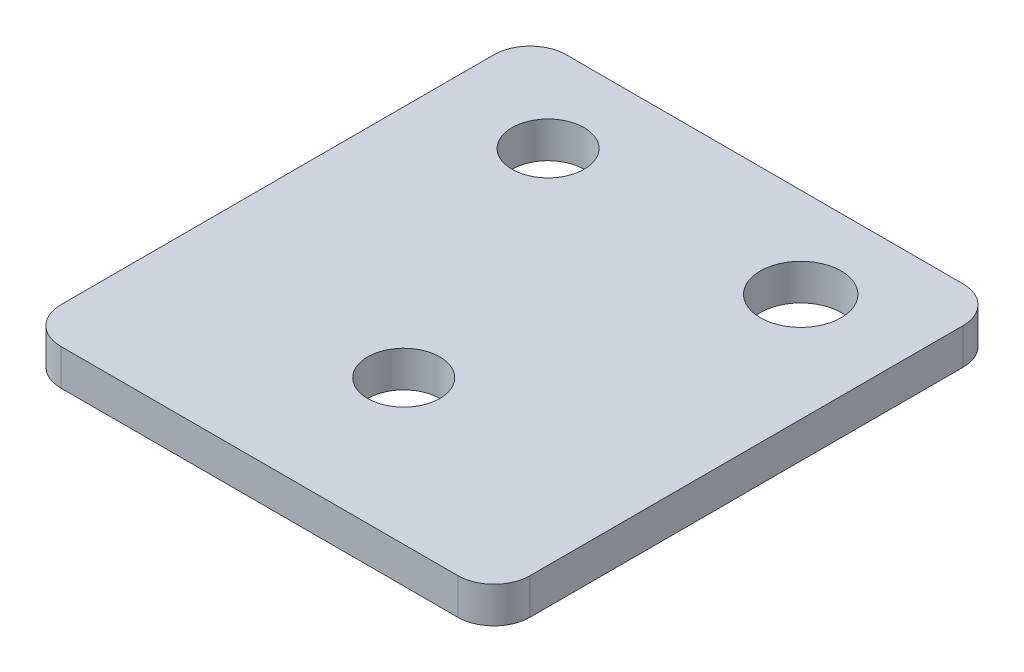
ISO-10303-21;
HEADER;
FILE_DESCRIPTION(('STEP AP214'),'2;1');
FILE_NAME('part.step','',(''),(''),'','','');
FILE_SCHEMA(('AUTOMOTIVE_DESIGN { 1 0 10303 214 1 1 1 1 }'));
ENDSEC;
DATA;
#1=APPLICATION_CONTEXT('core data for automotive mechanical design processes');
#2=APPLICATION_PROTOCOL_DEFINITION('international standard','automotive_design',2000,#1);
#3=PRODUCT_CONTEXT('',#1,'mechanical');
#4=PRODUCT('Part','Part','',(#3));
#5=PRODUCT_RELATED_PRODUCT_CATEGORY('part','',(#4));
#6=PRODUCT_DEFINITION_FORMATION('','',#4);
#7=PRODUCT_DEFINITION_CONTEXT('part definition',#1,'design');
#8=PRODUCT_DEFINITION('design','',#6,#7);
#9=PRODUCT_DEFINITION_SHAPE('','',#8);
#10=(LENGTH_UNIT() NAMED_UNIT(*) SI_UNIT(.MILLI.,.METRE.));
#11=(NAMED_UNIT(*) PLANE_ANGLE_UNIT() SI_UNIT($,.RADIAN.));
#12=(NAMED_UNIT(*) SI_UNIT($,.STERADIAN.) SOLID_ANGLE_UNIT());
#13=UNCERTAINTY_MEASURE_WITH_UNIT(LENGTH_MEASURE(1.E-05),#10,'distance_accuracy_value','');
#14=(GEOMETRIC_REPRESENTATION_CONTEXT(3) GLOBAL_UNCERTAINTY_ASSIGNED_CONTEXT((#13)) GLOBAL_UNIT_ASSIGNED_CONTEXT((#10,
#11,#12)) REPRESENTATION_CONTEXT('',''));
#15=CARTESIAN_POINT('',(0.,0.,0.));
#16=DIRECTION('',(0.,0.,1.));
#17=DIRECTION('',(1.,0.,0.));
#18=AXIS2_PLACEMENT_3D('',#15,#16,#17);
#19=CARTESIAN_POINT('',(0.,3.175,0.));
#20=DIRECTION('',(1.,0.,0.));
#21=DIRECTION('',(0.,0.,-1.));
#22=AXIS2_PLACEMENT_3D('',#19,#20,#21);
#23=PLANE('',#22);
#24=DIRECTION('',(0.,0.,1.));
#25=VECTOR('',#24,1.);
#26=CARTESIAN_POINT('',(0.,3.175,0.));
#27=LINE('',#26,#25);
#28=CARTESIAN_POINT('',(0.,3.175,-41.275));
#29=VERTEX_POINT('',#28);
#30=CARTESIAN_POINT('',(0.,3.175,-3.175));
#31=VERTEX_POINT('',#30);
#32=EDGE_CURVE('E128',#29,#31,#27,.T.);
#33=ORIENTED_EDGE('',*,*,#32,.F.);
#34=DIRECTION('',(0.,-1.,0.));
#35=VECTOR('',#34,1.);
#36=CARTESIAN_POINT('',(0.,3.175,-41.275));
#37=LINE('',#36,#35);
#38=CARTESIAN_POINT('',(0.,0.,-41.275));
#39=VERTEX_POINT('',#38);
#40=EDGE_CURVE('E11',#29,#39,#37,.T.);
#41=ORIENTED_EDGE('',*,*,#40,.T.);
#42=DIRECTION('',(0.,0.,1.));
#43=VECTOR('',#42,1.);
#44=CARTESIAN_POINT('',(0.,0.,0.));
#45=LINE('',#44,#43);
#46=CARTESIAN_POINT('',(0.,0.,-3.175));
#47=VERTEX_POINT('',#46);
#48=EDGE_CURVE('E130',#39,#47,#45,.T.);
#49=ORIENTED_EDGE('',*,*,#48,.T.);
#50=DIRECTION('',(0.,-1.,0.));
#51=VECTOR('',#50,1.);
#52=CARTESIAN_POINT('',(0.,3.175,-3.175));
#53=LINE('',#52,#51);
#54=EDGE_CURVE('E41',#47,#31,#53,.F.);
#55=ORIENTED_EDGE('',*,*,#54,.T.);
#56=EDGE_LOOP('',(#33,#41,#49,#55));
#57=FACE_BOUND('',#56,.T.);
#58=ADVANCED_FACE('F33',(#57),#23,.F.);
#59=CARTESIAN_POINT('',(0.,3.175,0.));
#60=DIRECTION('',(0.,0.,-1.));
#61=DIRECTION('',(-1.,0.,0.));
#62=AXIS2_PLACEMENT_3D('',#59,#60,#61);
#63=PLANE('',#62);
#64=DIRECTION('',(1.,0.,0.));
#65=VECTOR('',#64,1.);
#66=CARTESIAN_POINT('',(0.,0.,0.));
#67=LINE('',#66,#65);
#68=CARTESIAN_POINT('',(3.175,0.,0.));
#69=VERTEX_POINT('',#68);
#70=CARTESIAN_POINT('',(38.1,0.,0.));
#71=VERTEX_POINT('',#70);
#72=EDGE_CURVE('E126',#69,#71,#67,.T.);
#73=ORIENTED_EDGE('',*,*,#72,.T.);
#74=DIRECTION('',(0.,-1.,0.));
#75=VECTOR('',#74,1.);
#76=CARTESIAN_POINT('',(38.1,3.175,0.));
#77=LINE('',#76,#75);
#78=CARTESIAN_POINT('',(38.1,3.175,0.));
#79=VERTEX_POINT('',#78);
#80=EDGE_CURVE('E105',#71,#79,#77,.F.);
#81=ORIENTED_EDGE('',*,*,#80,.T.);
#82=DIRECTION('',(1.,0.,0.));
#83=VECTOR('',#82,1.);
#84=CARTESIAN_POINT('',(0.,3.175,0.));
#85=LINE('',#84,#83);
#86=CARTESIAN_POINT('',(3.175,3.175,0.));
#87=VERTEX_POINT('',#86);
#88=EDGE_CURVE('E166',#87,#79,#85,.T.);
#89=ORIENTED_EDGE('',*,*,#88,.F.);
#90=DIRECTION('',(0.,-1.,0.));
#91=VECTOR('',#90,1.);
#92=CARTESIAN_POINT('',(3.175,3.175,0.));
#93=LINE('',#92,#91);
#94=EDGE_CURVE('E110',#87,#69,#93,.T.);
#95=ORIENTED_EDGE('',*,*,#94,.T.);
#96=EDGE_LOOP('',(#73,#81,#89,#95));
#97=FACE_BOUND('',#96,.T.);
#98=ADVANCED_FACE('F170',(#97),#63,.F.);
#99=CARTESIAN_POINT('',(41.275,3.175,0.));
#100=DIRECTION('',(-1.,0.,0.));
#101=DIRECTION('',(0.,0.,1.));
#102=AXIS2_PLACEMENT_3D('',#99,#100,#101);
#103=PLANE('',#102);
#104=DIRECTION('',(0.,0.,-1.));
#105=VECTOR('',#104,1.);
#106=CARTESIAN_POINT('',(41.275,3.175,0.));
#107=LINE('',#106,#105);
#108=CARTESIAN_POINT('',(41.275,3.175,-3.175));
#109=VERTEX_POINT('',#108);
#110=CARTESIAN_POINT('',(41.275,3.175,-41.275));
#111=VERTEX_POINT('',#110);
#112=EDGE_CURVE('E119',#109,#111,#107,.T.);
#113=ORIENTED_EDGE('',*,*,#112,.F.);
#114=DIRECTION('',(0.,-1.,0.));
#115=VECTOR('',#114,1.);
#116=CARTESIAN_POINT('',(41.275,3.175,-3.175));
#117=LINE('',#116,#115);
#118=CARTESIAN_POINT('',(41.275,0.,-3.175));
#119=VERTEX_POINT('',#118);
#120=EDGE_CURVE('E104',#109,#119,#117,.T.);
#121=ORIENTED_EDGE('',*,*,#120,.T.);
#122=DIRECTION('',(0.,0.,-1.));
#123=VECTOR('',#122,1.);
#124=CARTESIAN_POINT('',(41.275,0.,0.));
#125=LINE('',#124,#123);
#126=CARTESIAN_POINT('',(41.275,0.,-41.275));
#127=VERTEX_POINT('',#126);
#128=EDGE_CURVE('E117',#119,#127,#125,.T.);
#129=ORIENTED_EDGE('',*,*,#128,.T.);
#130=DIRECTION('',(0.,-1.,0.));
#131=VECTOR('',#130,1.);
#132=CARTESIAN_POINT('',(41.275,3.175,-41.275));
#133=LINE('',#132,#131);
#134=EDGE_CURVE('E121',#127,#111,#133,.F.);
#135=ORIENTED_EDGE('',*,*,#134,.T.);
#136=EDGE_LOOP('',(#113,#121,#129,#135));
#137=FACE_BOUND('',#136,.T.);
#138=ADVANCED_FACE('F116',(#137),#103,.F.);
#139=CARTESIAN_POINT('',(0.,3.175,-44.45));
#140=DIRECTION('',(0.,0.,1.));
#141=DIRECTION('',(1.,0.,0.));
#142=AXIS2_PLACEMENT_3D('',#139,#140,#141);
#143=PLANE('',#142);
#144=DIRECTION('',(-1.,0.,0.));
#145=VECTOR('',#144,1.);
#146=CARTESIAN_POINT('',(0.,3.175,-44.45));
#147=LINE('',#146,#145);
#148=CARTESIAN_POINT('',(38.1,3.175,-44.45));
#149=VERTEX_POINT('',#148);
#150=CARTESIAN_POINT('',(3.175,3.175,-44.45));
#151=VERTEX_POINT('',#150);
#152=EDGE_CURVE('E134',#149,#151,#147,.T.);
#153=ORIENTED_EDGE('',*,*,#152,.F.);
#154=DIRECTION('',(0.,-1.,0.));
#155=VECTOR('',#154,1.);
#156=CARTESIAN_POINT('',(38.1,3.175,-44.45));
#157=LINE('',#156,#155);
#158=CARTESIAN_POINT('',(38.1,0.,-44.45));
#159=VERTEX_POINT('',#158);
#160=EDGE_CURVE('E151',#149,#159,#157,.T.);
#161=ORIENTED_EDGE('',*,*,#160,.T.);
#162=DIRECTION('',(-1.,0.,0.));
#163=VECTOR('',#162,1.);
#164=CARTESIAN_POINT('',(0.,0.,-44.45));
#165=LINE('',#164,#163);
#166=CARTESIAN_POINT('',(3.175,0.,-44.45));
#167=VERTEX_POINT('',#166);
#168=EDGE_CURVE('E125',#159,#167,#165,.T.);
#169=ORIENTED_EDGE('',*,*,#168,.T.);
#170=DIRECTION('',(0.,-1.,0.));
#171=VECTOR('',#170,1.);
#172=CARTESIAN_POINT('',(3.175,3.175,-44.45));
#173=LINE('',#172,#171);
#174=EDGE_CURVE('E48',#167,#151,#173,.F.);
#175=ORIENTED_EDGE('',*,*,#174,.T.);
#176=EDGE_LOOP('',(#153,#161,#169,#175));
#177=FACE_BOUND('',#176,.T.);
#178=ADVANCED_FACE('F205',(#177),#143,.F.);
#179=CARTESIAN_POINT('',(0.,3.175,0.));
#180=DIRECTION('',(0.,-1.,0.));
#181=DIRECTION('',(0.,0.,-1.));
#182=AXIS2_PLACEMENT_3D('',#179,#180,#181);
#183=PLANE('',#182);
#184=CARTESIAN_POINT('',(20.6375,3.175,-12.7));
#185=DIRECTION('',(0.,1.,0.));
#186=DIRECTION('',(0.,0.,1.));
#187=AXIS2_PLACEMENT_3D('',#184,#185,#186);
#188=CIRCLE('',#187,3.175);
#189=CARTESIAN_POINT('',(20.6375,3.175,-9.525));
#190=VERTEX_POINT('',#189);
#191=EDGE_CURVE('E188',#190,#190,#188,.T.);
#192=ORIENTED_EDGE('',*,*,#191,.F.);
#193=EDGE_LOOP('',(#192));
#194=FACE_BOUND('',#193,.T.);
#195=CARTESIAN_POINT('',(31.75,3.175,-36.5125));
#196=DIRECTION('',(0.,1.,0.));
#197=DIRECTION('',(0.,0.,1.));
#198=AXIS2_PLACEMENT_3D('',#195,#196,#197);
#199=CIRCLE('',#198,3.56169670637034);
#200=CARTESIAN_POINT('',(31.75,3.175,-32.9508032936296));
#201=VERTEX_POINT('',#200);
#202=EDGE_CURVE('E182',#201,#201,#199,.T.);
#203=ORIENTED_EDGE('',*,*,#202,.F.);
#204=EDGE_LOOP('',(#203));
#205=FACE_BOUND('',#204,.T.);
#206=CARTESIAN_POINT('',(9.525,3.175,-36.5125));
#207=DIRECTION('',(0.,1.,0.));
#208=DIRECTION('',(0.,0.,1.));
#209=AXIS2_PLACEMENT_3D('',#206,#207,#208);
#210=CIRCLE('',#209,3.175);
#211=CARTESIAN_POINT('',(9.525,3.175,-33.3375));
#212=VERTEX_POINT('',#211);
#213=EDGE_CURVE('E173',#212,#212,#210,.T.);
#214=ORIENTED_EDGE('',*,*,#213,.F.);
#215=EDGE_LOOP('',(#214));
#216=FACE_BOUND('',#215,.T.);
#217=ORIENTED_EDGE('',*,*,#88,.T.);
#218=CARTESIAN_POINT('',(38.1,3.175,-3.175));
#219=DIRECTION('',(0.,-1.,0.));
#220=DIRECTION('',(0.,0.,-1.));
#221=AXIS2_PLACEMENT_3D('',#218,#219,#220);
#222=CIRCLE('',#221,3.175);
#223=EDGE_CURVE('E148',#79,#109,#222,.F.);
#224=ORIENTED_EDGE('',*,*,#223,.T.);
#225=ORIENTED_EDGE('',*,*,#112,.T.);
#226=CARTESIAN_POINT('',(38.1,3.175,-41.275));
#227=DIRECTION('',(0.,-1.,0.));
#228=DIRECTION('',(0.,0.,-1.));
#229=AXIS2_PLACEMENT_3D('',#226,#227,#228);
#230=CIRCLE('',#229,3.175);
#231=EDGE_CURVE('E55',#111,#149,#230,.F.);
#232=ORIENTED_EDGE('',*,*,#231,.T.);
#233=ORIENTED_EDGE('',*,*,#152,.T.);
#234=CARTESIAN_POINT('',(3.175,3.175,-41.275));
#235=DIRECTION('',(0.,-1.,0.));
#236=DIRECTION('',(0.,0.,-1.));
#237=AXIS2_PLACEMENT_3D('',#234,#235,#236);
#238=CIRCLE('',#237,3.175);
#239=EDGE_CURVE('E145',#151,#29,#238,.F.);
#240=ORIENTED_EDGE('',*,*,#239,.T.);
#241=ORIENTED_EDGE('',*,*,#32,.T.);
#242=CARTESIAN_POINT('',(3.175,3.175,-3.175));
#243=DIRECTION('',(0.,-1.,0.));
#244=DIRECTION('',(0.,0.,-1.));
#245=AXIS2_PLACEMENT_3D('',#242,#243,#244);
#246=CIRCLE('',#245,3.175);
#247=EDGE_CURVE('E143',#31,#87,#246,.F.);
#248=ORIENTED_EDGE('',*,*,#247,.T.);
#249=EDGE_LOOP('',(#217,#224,#225,#232,#233,#240,#241,#248));
#250=FACE_BOUND('',#249,.T.);
#251=ADVANCED_FACE('F163',(#194,#205,#216,#250),#183,.F.);
#252=CARTESIAN_POINT('',(0.,0.,0.));
#253=DIRECTION('',(0.,-1.,0.));
#254=DIRECTION('',(0.,0.,-1.));
#255=AXIS2_PLACEMENT_3D('',#252,#253,#254);
#256=PLANE('',#255);
#257=CARTESIAN_POINT('',(20.6375,0.,-12.7));
#258=DIRECTION('',(0.,1.,0.));
#259=DIRECTION('',(0.,0.,1.));
#260=AXIS2_PLACEMENT_3D('',#257,#258,#259);
#261=CIRCLE('',#260,3.175);
#262=CARTESIAN_POINT('',(20.6375,0.,-9.525));
#263=VERTEX_POINT('',#262);
#264=EDGE_CURVE('E185',#263,#263,#261,.T.);
#265=ORIENTED_EDGE('',*,*,#264,.T.);
#266=EDGE_LOOP('',(#265));
#267=FACE_BOUND('',#266,.T.);
#268=CARTESIAN_POINT('',(31.75,0.,-36.5125));
#269=DIRECTION('',(0.,1.,0.));
#270=DIRECTION('',(0.,0.,1.));
#271=AXIS2_PLACEMENT_3D('',#268,#269,#270);
#272=CIRCLE('',#271,3.56169670637034);
#273=CARTESIAN_POINT('',(31.75,0.,-32.9508032936296));
#274=VERTEX_POINT('',#273);
#275=EDGE_CURVE('E180',#274,#274,#272,.T.);
#276=ORIENTED_EDGE('',*,*,#275,.T.);
#277=EDGE_LOOP('',(#276));
#278=FACE_BOUND('',#277,.T.);
#279=CARTESIAN_POINT('',(9.525,0.,-36.5125));
#280=DIRECTION('',(0.,1.,0.));
#281=DIRECTION('',(0.,0.,1.));
#282=AXIS2_PLACEMENT_3D('',#279,#280,#281);
#283=CIRCLE('',#282,3.175);
#284=CARTESIAN_POINT('',(9.525,0.,-33.3375));
#285=VERTEX_POINT('',#284);
#286=EDGE_CURVE('E171',#285,#285,#283,.T.);
#287=ORIENTED_EDGE('',*,*,#286,.T.);
#288=EDGE_LOOP('',(#287));
#289=FACE_BOUND('',#288,.T.);
#290=ORIENTED_EDGE('',*,*,#128,.F.);
#291=CARTESIAN_POINT('',(38.1,0.,-3.175));
#292=DIRECTION('',(0.,-1.,0.));
#293=DIRECTION('',(0.,0.,-1.));
#294=AXIS2_PLACEMENT_3D('',#291,#292,#293);
#295=CIRCLE('',#294,3.175);
#296=EDGE_CURVE('E100',#119,#71,#295,.T.);
#297=ORIENTED_EDGE('',*,*,#296,.T.);
#298=ORIENTED_EDGE('',*,*,#72,.F.);
#299=CARTESIAN_POINT('',(3.175,0.,-3.175));
#300=DIRECTION('',(0.,-1.,0.));
#301=DIRECTION('',(0.,0.,-1.));
#302=AXIS2_PLACEMENT_3D('',#299,#300,#301);
#303=CIRCLE('',#302,3.175);
#304=EDGE_CURVE('E120',#69,#47,#303,.T.);
#305=ORIENTED_EDGE('',*,*,#304,.T.);
#306=ORIENTED_EDGE('',*,*,#48,.F.);
#307=CARTESIAN_POINT('',(3.175,0.,-41.275));
#308=DIRECTION('',(0.,-1.,0.));
#309=DIRECTION('',(0.,0.,-1.));
#310=AXIS2_PLACEMENT_3D('',#307,#308,#309);
#311=CIRCLE('',#310,3.175);
#312=EDGE_CURVE('E137',#39,#167,#311,.T.);
#313=ORIENTED_EDGE('',*,*,#312,.T.);
#314=ORIENTED_EDGE('',*,*,#168,.F.);
#315=CARTESIAN_POINT('',(38.1,0.,-41.275));
#316=DIRECTION('',(0.,-1.,0.));
#317=DIRECTION('',(0.,0.,-1.));
#318=AXIS2_PLACEMENT_3D('',#315,#316,#317);
#319=CIRCLE('',#318,3.175);
#320=EDGE_CURVE('E111',#159,#127,#319,.T.);
#321=ORIENTED_EDGE('',*,*,#320,.T.);
#322=EDGE_LOOP('',(#290,#297,#298,#305,#306,#313,#314,#321));
#323=FACE_BOUND('',#322,.T.);
#324=ADVANCED_FACE('F123',(#267,#278,#289,#323),#256,.T.);
#325=CARTESIAN_POINT('',(38.1,3.175,-3.175));
#326=DIRECTION('',(0.,-1.,0.));
#327=DIRECTION('',(0.,0.,-1.));
#328=AXIS2_PLACEMENT_3D('',#325,#326,#327);
#329=CYLINDRICAL_SURFACE('',#328,3.175);
#330=ORIENTED_EDGE('',*,*,#223,.F.);
#331=ORIENTED_EDGE('',*,*,#80,.F.);
#332=ORIENTED_EDGE('',*,*,#296,.F.);
#333=ORIENTED_EDGE('',*,*,#120,.F.);
#334=EDGE_LOOP('',(#330,#331,#332,#333));
#335=FACE_BOUND('',#334,.T.);
#336=ADVANCED_FACE('F103',(#335),#329,.T.);
#337=CARTESIAN_POINT('',(38.1,3.175,-41.275));
#338=DIRECTION('',(0.,-1.,0.));
#339=DIRECTION('',(0.,0.,-1.));
#340=AXIS2_PLACEMENT_3D('',#337,#338,#339);
#341=CYLINDRICAL_SURFACE('',#340,3.175);
#342=ORIENTED_EDGE('',*,*,#231,.F.);
#343=ORIENTED_EDGE('',*,*,#134,.F.);
#344=ORIENTED_EDGE('',*,*,#320,.F.);
#345=ORIENTED_EDGE('',*,*,#160,.F.);
#346=EDGE_LOOP('',(#342,#343,#344,#345));
#347=FACE_BOUND('',#346,.T.);
#348=ADVANCED_FACE('F233',(#347),#341,.T.);
#349=CARTESIAN_POINT('',(3.175,3.175,-41.275));
#350=DIRECTION('',(0.,-1.,0.));
#351=DIRECTION('',(0.,0.,-1.));
#352=AXIS2_PLACEMENT_3D('',#349,#350,#351);
#353=CYLINDRICAL_SURFACE('',#352,3.175);
#354=ORIENTED_EDGE('',*,*,#239,.F.);
#355=ORIENTED_EDGE('',*,*,#174,.F.);
#356=ORIENTED_EDGE('',*,*,#312,.F.);
#357=ORIENTED_EDGE('',*,*,#40,.F.);
#358=EDGE_LOOP('',(#354,#355,#356,#357));
#359=FACE_BOUND('',#358,.T.);
#360=ADVANCED_FACE('F221',(#359),#353,.T.);
#361=CARTESIAN_POINT('',(3.175,3.175,-3.175));
#362=DIRECTION('',(0.,-1.,0.));
#363=DIRECTION('',(0.,0.,-1.));
#364=AXIS2_PLACEMENT_3D('',#361,#362,#363);
#365=CYLINDRICAL_SURFACE('',#364,3.175);
#366=ORIENTED_EDGE('',*,*,#247,.F.);
#367=ORIENTED_EDGE('',*,*,#54,.F.);
#368=ORIENTED_EDGE('',*,*,#304,.F.);
#369=ORIENTED_EDGE('',*,*,#94,.F.);
#370=EDGE_LOOP('',(#366,#367,#368,#369));
#371=FACE_BOUND('',#370,.T.);
#372=ADVANCED_FACE('F35',(#371),#365,.T.);
#373=CARTESIAN_POINT('',(9.525,0.,-36.5125));
#374=DIRECTION('',(0.,1.,0.));
#375=DIRECTION('',(0.,0.,1.));
#376=AXIS2_PLACEMENT_3D('',#373,#374,#375);
#377=CYLINDRICAL_SURFACE('',#376,3.175);
#378=ORIENTED_EDGE('',*,*,#286,.F.);
#379=EDGE_LOOP('',(#378));
#380=FACE_BOUND('',#379,.T.);
#381=ORIENTED_EDGE('',*,*,#213,.T.);
#382=EDGE_LOOP('',(#381));
#383=FACE_BOUND('',#382,.T.);
#384=ADVANCED_FACE('F211',(#380,#383),#377,.F.);
#385=CARTESIAN_POINT('',(31.75,0.,-36.5125));
#386=DIRECTION('',(0.,1.,0.));
#387=DIRECTION('',(0.,0.,1.));
#388=AXIS2_PLACEMENT_3D('',#385,#386,#387);
#389=CYLINDRICAL_SURFACE('',#388,3.56169670637034);
#390=ORIENTED_EDGE('',*,*,#275,.F.);
#391=EDGE_LOOP('',(#390));
#392=FACE_BOUND('',#391,.T.);
#393=ORIENTED_EDGE('',*,*,#202,.T.);
#394=EDGE_LOOP('',(#393));
#395=FACE_BOUND('',#394,.T.);
#396=ADVANCED_FACE('F199',(#392,#395),#389,.F.);
#397=CARTESIAN_POINT('',(20.6375,0.,-12.7));
#398=DIRECTION('',(0.,1.,0.));
#399=DIRECTION('',(0.,0.,1.));
#400=AXIS2_PLACEMENT_3D('',#397,#398,#399);
#401=CYLINDRICAL_SURFACE('',#400,3.175);
#402=ORIENTED_EDGE('',*,*,#264,.F.);
#403=EDGE_LOOP('',(#402));
#404=FACE_BOUND('',#403,.T.);
#405=ORIENTED_EDGE('',*,*,#191,.T.);
#406=EDGE_LOOP('',(#405));
#407=FACE_BOUND('',#406,.T.);
#408=ADVANCED_FACE('F196',(#404,#407),#401,.F.);
#409=CLOSED_SHELL('',(#58,#98,#138,#178,#251,#324,#336,#348,#360,#372,#384,#396,#408));
#410=MANIFOLD_SOLID_BREP('B2',#409);
#411=ADVANCED_BREP_SHAPE_REPRESENTATION('',(#18,#410),#14);
#412=SHAPE_DEFINITION_REPRESENTATION(#9,#411);
ENDSEC;
END-ISO-10303-21;
